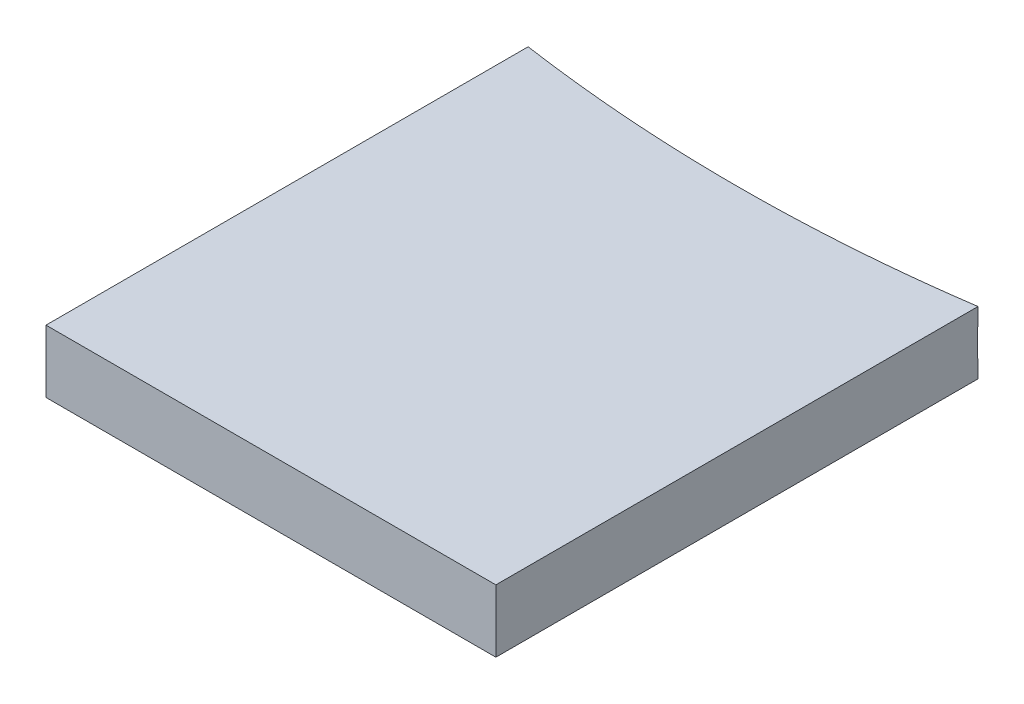
ISO-10303-21;
HEADER;
FILE_DESCRIPTION(('STEP AP214'),'2;1');
FILE_NAME('part.step','',(''),(''),'','','');
FILE_SCHEMA(('AUTOMOTIVE_DESIGN { 1 0 10303 214 1 1 1 1 }'));
ENDSEC;
DATA;
#1=APPLICATION_CONTEXT('core data for automotive mechanical design processes');
#2=APPLICATION_PROTOCOL_DEFINITION('international standard','automotive_design',2000,#1);
#3=PRODUCT_CONTEXT('',#1,'mechanical');
#4=PRODUCT('Part','Part','',(#3));
#5=PRODUCT_RELATED_PRODUCT_CATEGORY('part','',(#4));
#6=PRODUCT_DEFINITION_FORMATION('','',#4);
#7=PRODUCT_DEFINITION_CONTEXT('part definition',#1,'design');
#8=PRODUCT_DEFINITION('design','',#6,#7);
#9=PRODUCT_DEFINITION_SHAPE('','',#8);
#10=(LENGTH_UNIT() NAMED_UNIT(*) SI_UNIT(.MILLI.,.METRE.));
#11=(NAMED_UNIT(*) PLANE_ANGLE_UNIT() SI_UNIT($,.RADIAN.));
#12=(NAMED_UNIT(*) SI_UNIT($,.STERADIAN.) SOLID_ANGLE_UNIT());
#13=UNCERTAINTY_MEASURE_WITH_UNIT(LENGTH_MEASURE(1.E-05),#10,'distance_accuracy_value','');
#14=(GEOMETRIC_REPRESENTATION_CONTEXT(3) GLOBAL_UNCERTAINTY_ASSIGNED_CONTEXT((#13)) GLOBAL_UNIT_ASSIGNED_CONTEXT((#10,
#11,#12)) REPRESENTATION_CONTEXT('',''));
#15=CARTESIAN_POINT('',(0.,0.,0.));
#16=DIRECTION('',(0.,0.,1.));
#17=DIRECTION('',(1.,0.,0.));
#18=AXIS2_PLACEMENT_3D('',#15,#16,#17);
#19=CARTESIAN_POINT('',(46.2957592213328,-3.17746013968215,-25.2932026262591));
#20=DIRECTION('',(1.,0.,0.));
#21=DIRECTION('',(0.,0.,-1.));
#22=AXIS2_PLACEMENT_3D('',#19,#20,#21);
#23=PLANE('',#22);
#24=CARTESIAN_POINT('',(46.2957592213328,-2.74566013968216,-3.77268804742259));
#25=DIRECTION('',(1.,0.,0.));
#26=DIRECTION('',(0.,0.,-1.));
#27=AXIS2_PLACEMENT_3D('',#24,#25,#26);
#28=CIRCLE('',#27,21.2952329470414);
#29=CARTESIAN_POINT('',(46.2957592213328,-2.31386013968215,17.5181666801068));
#30=VERTEX_POINT('',#29);
#31=CARTESIAN_POINT('',(46.2957592213328,-3.17746013968215,17.5181666801068));
#32=VERTEX_POINT('',#31);
#33=EDGE_CURVE('E44',#30,#32,#28,.T.);
#34=ORIENTED_EDGE('',*,*,#33,.F.);
#35=DIRECTION('',(0.,0.,1.));
#36=VECTOR('',#35,1.);
#37=CARTESIAN_POINT('',(46.2957592213328,-2.31386013968215,-25.2932026262591));
#38=LINE('',#37,#36);
#39=CARTESIAN_POINT('',(46.2957592213328,-2.31386013968215,24.160326531414));
#40=VERTEX_POINT('',#39);
#41=EDGE_CURVE('E97',#30,#40,#38,.T.);
#42=ORIENTED_EDGE('',*,*,#41,.T.);
#43=DIRECTION('',(0.,1.,0.));
#44=VECTOR('',#43,1.);
#45=CARTESIAN_POINT('',(46.2957592213328,-3.17746013968215,24.160326531414));
#46=LINE('',#45,#44);
#47=CARTESIAN_POINT('',(46.2957592213328,-3.17746013968215,24.160326531414));
#48=VERTEX_POINT('',#47);
#49=EDGE_CURVE('E88',#48,#40,#46,.T.);
#50=ORIENTED_EDGE('',*,*,#49,.F.);
#51=DIRECTION('',(0.,0.,1.));
#52=VECTOR('',#51,1.);
#53=CARTESIAN_POINT('',(46.2957592213328,-3.17746013968215,-25.2932026262591));
#54=LINE('',#53,#52);
#55=EDGE_CURVE('E69',#32,#48,#54,.T.);
#56=ORIENTED_EDGE('',*,*,#55,.F.);
#57=EDGE_LOOP('',(#34,#42,#50,#56));
#58=FACE_BOUND('',#57,.T.);
#59=ADVANCED_FACE('F34',(#58),#23,.T.);
#60=CARTESIAN_POINT('',(40.0981592213328,-3.17746013968215,-25.2932026262591));
#61=DIRECTION('',(0.,-1.,0.));
#62=DIRECTION('',(0.,0.,-1.));
#63=AXIS2_PLACEMENT_3D('',#60,#61,#62);
#64=PLANE('',#63);
#65=CARTESIAN_POINT('',(43.1969592213328,-3.17746013968215,-3.77268804742259));
#66=DIRECTION('',(0.,-1.,0.));
#67=DIRECTION('',(0.,0.,-1.));
#68=AXIS2_PLACEMENT_3D('',#65,#66,#67);
#69=CIRCLE('',#68,21.5151819994338);
#70=CARTESIAN_POINT('',(40.0981592213328,-3.17746013968215,17.5181666801068));
#71=VERTEX_POINT('',#70);
#72=EDGE_CURVE('E12',#32,#71,#69,.T.);
#73=ORIENTED_EDGE('',*,*,#72,.F.);
#74=ORIENTED_EDGE('',*,*,#55,.T.);
#75=DIRECTION('',(1.,0.,0.));
#76=VECTOR('',#75,1.);
#77=CARTESIAN_POINT('',(40.0981592213328,-3.17746013968215,24.160326531414));
#78=LINE('',#77,#76);
#79=CARTESIAN_POINT('',(40.0981592213328,-3.17746013968215,24.160326531414));
#80=VERTEX_POINT('',#79);
#81=EDGE_CURVE('E84',#80,#48,#78,.T.);
#82=ORIENTED_EDGE('',*,*,#81,.F.);
#83=DIRECTION('',(0.,0.,1.));
#84=VECTOR('',#83,1.);
#85=CARTESIAN_POINT('',(40.0981592213328,-3.17746013968215,-25.2932026262591));
#86=LINE('',#85,#84);
#87=EDGE_CURVE('E75',#71,#80,#86,.T.);
#88=ORIENTED_EDGE('',*,*,#87,.F.);
#89=EDGE_LOOP('',(#73,#74,#82,#88));
#90=FACE_BOUND('',#89,.T.);
#91=ADVANCED_FACE('F85',(#90),#64,.T.);
#92=CARTESIAN_POINT('',(40.0981592213328,-3.17746013968215,-25.2932026262591));
#93=DIRECTION('',(-1.,0.,0.));
#94=DIRECTION('',(0.,0.,1.));
#95=AXIS2_PLACEMENT_3D('',#92,#93,#94);
#96=PLANE('',#95);
#97=CARTESIAN_POINT('',(40.0981592213328,-2.74566013968216,-3.77268804742259));
#98=DIRECTION('',(-1.,0.,0.));
#99=DIRECTION('',(0.,0.,1.));
#100=AXIS2_PLACEMENT_3D('',#97,#98,#99);
#101=CIRCLE('',#100,21.2952329470414);
#102=CARTESIAN_POINT('',(40.0981592213328,-2.31386013968215,17.5181666801068));
#103=VERTEX_POINT('',#102);
#104=EDGE_CURVE('E38',#71,#103,#101,.T.);
#105=ORIENTED_EDGE('',*,*,#104,.F.);
#106=ORIENTED_EDGE('',*,*,#87,.T.);
#107=DIRECTION('',(0.,-1.,0.));
#108=VECTOR('',#107,1.);
#109=CARTESIAN_POINT('',(40.0981592213328,-3.17746013968215,24.160326531414));
#110=LINE('',#109,#108);
#111=CARTESIAN_POINT('',(40.0981592213328,-2.31386013968215,24.160326531414));
#112=VERTEX_POINT('',#111);
#113=EDGE_CURVE('E79',#112,#80,#110,.T.);
#114=ORIENTED_EDGE('',*,*,#113,.F.);
#115=DIRECTION('',(0.,0.,1.));
#116=VECTOR('',#115,1.);
#117=CARTESIAN_POINT('',(40.0981592213328,-2.31386013968215,-25.2932026262591));
#118=LINE('',#117,#116);
#119=EDGE_CURVE('E81',#103,#112,#118,.T.);
#120=ORIENTED_EDGE('',*,*,#119,.F.);
#121=EDGE_LOOP('',(#105,#106,#114,#120));
#122=FACE_BOUND('',#121,.T.);
#123=ADVANCED_FACE('F76',(#122),#96,.T.);
#124=CARTESIAN_POINT('',(40.0981592213328,-2.31386013968215,-25.2932026262591));
#125=DIRECTION('',(0.,1.,0.));
#126=DIRECTION('',(0.,0.,1.));
#127=AXIS2_PLACEMENT_3D('',#124,#125,#126);
#128=PLANE('',#127);
#129=CARTESIAN_POINT('',(43.1969592213328,-2.31386013968215,-3.77268804742259));
#130=DIRECTION('',(0.,1.,0.));
#131=DIRECTION('',(0.,0.,1.));
#132=AXIS2_PLACEMENT_3D('',#129,#130,#131);
#133=CIRCLE('',#132,21.5151819994338);
#134=EDGE_CURVE('E100',#103,#30,#133,.T.);
#135=ORIENTED_EDGE('',*,*,#134,.F.);
#136=ORIENTED_EDGE('',*,*,#119,.T.);
#137=DIRECTION('',(-1.,0.,0.));
#138=VECTOR('',#137,1.);
#139=CARTESIAN_POINT('',(40.0981592213328,-2.31386013968215,24.160326531414));
#140=LINE('',#139,#138);
#141=EDGE_CURVE('E92',#40,#112,#140,.T.);
#142=ORIENTED_EDGE('',*,*,#141,.F.);
#143=ORIENTED_EDGE('',*,*,#41,.F.);
#144=EDGE_LOOP('',(#135,#136,#142,#143));
#145=FACE_BOUND('',#144,.T.);
#146=ADVANCED_FACE('F108',(#145),#128,.T.);
#147=CARTESIAN_POINT('',(0.,0.,24.160326531414));
#148=DIRECTION('',(0.,0.,-1.));
#149=DIRECTION('',(-1.,0.,0.));
#150=AXIS2_PLACEMENT_3D('',#147,#148,#149);
#151=PLANE('',#150);
#152=ORIENTED_EDGE('',*,*,#113,.T.);
#153=ORIENTED_EDGE('',*,*,#81,.T.);
#154=ORIENTED_EDGE('',*,*,#49,.T.);
#155=ORIENTED_EDGE('',*,*,#141,.T.);
#156=EDGE_LOOP('',(#152,#153,#154,#155));
#157=FACE_BOUND('',#156,.T.);
#158=ADVANCED_FACE('F90',(#157),#151,.F.);
#159=CARTESIAN_POINT('',(43.1969592213328,-2.74566013968216,-3.77268804742259));
#160=DIRECTION('',(0.,0.,1.));
#161=DIRECTION('',(1.,0.,0.));
#162=AXIS2_PLACEMENT_3D('',#159,#160,#161);
#163=SPHERICAL_SURFACE('',#162,21.5195145788366);
#164=ORIENTED_EDGE('',*,*,#104,.T.);
#165=ORIENTED_EDGE('',*,*,#134,.T.);
#166=ORIENTED_EDGE('',*,*,#33,.T.);
#167=ORIENTED_EDGE('',*,*,#72,.T.);
#168=EDGE_LOOP('',(#164,#165,#166,#167));
#169=FACE_BOUND('',#168,.T.);
#170=ADVANCED_FACE('F36',(#169),#163,.F.);
#171=CLOSED_SHELL('',(#59,#91,#123,#146,#158,#170));
#172=MANIFOLD_SOLID_BREP('B2',#171);
#173=ADVANCED_BREP_SHAPE_REPRESENTATION('',(#18,#172),#14);
#174=SHAPE_DEFINITION_REPRESENTATION(#9,#173);
ENDSEC;
END-ISO-10303-21;
